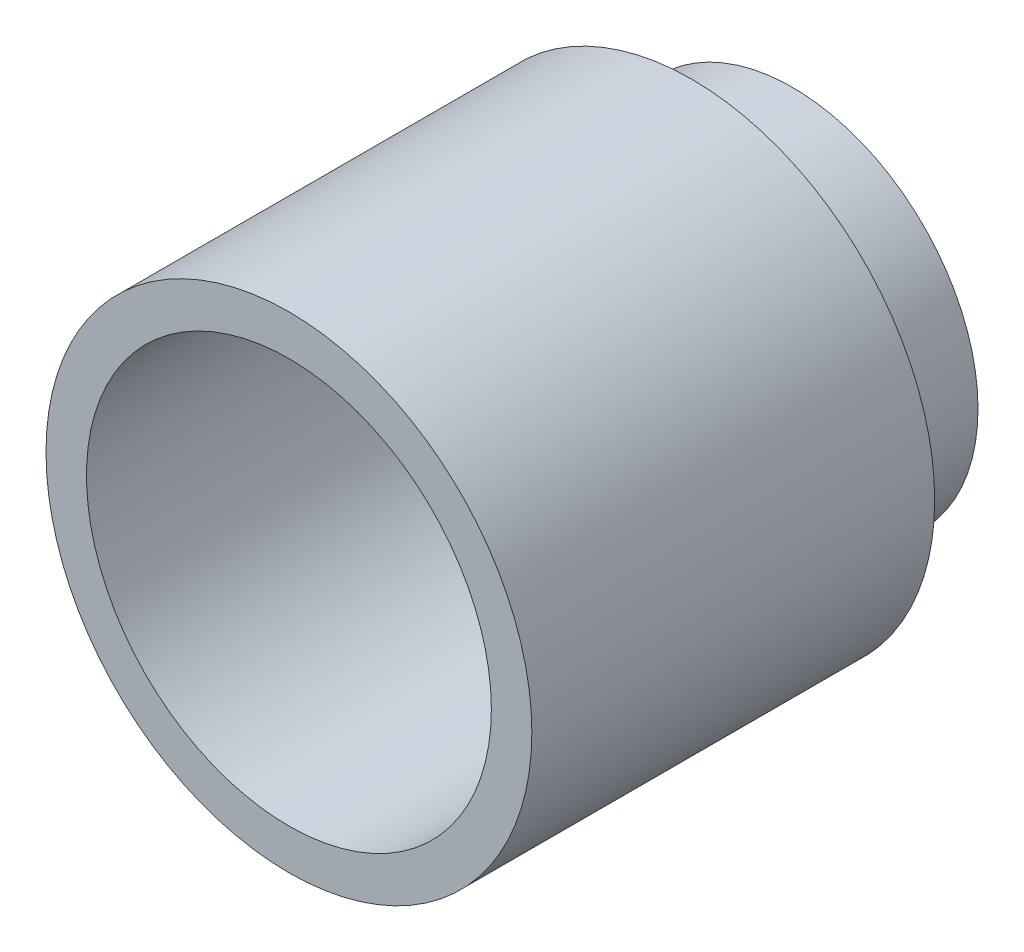
ISO-10303-21;
HEADER;
FILE_DESCRIPTION(('STEP AP214'),'2;1');
FILE_NAME('part.step','',(''),(''),'','','');
FILE_SCHEMA(('AUTOMOTIVE_DESIGN { 1 0 10303 214 1 1 1 1 }'));
ENDSEC;
DATA;
#1=APPLICATION_CONTEXT('core data for automotive mechanical design processes');
#2=APPLICATION_PROTOCOL_DEFINITION('international standard','automotive_design',2000,#1);
#3=PRODUCT_CONTEXT('',#1,'mechanical');
#4=PRODUCT('Part','Part','',(#3));
#5=PRODUCT_RELATED_PRODUCT_CATEGORY('part','',(#4));
#6=PRODUCT_DEFINITION_FORMATION('','',#4);
#7=PRODUCT_DEFINITION_CONTEXT('part definition',#1,'design');
#8=PRODUCT_DEFINITION('design','',#6,#7);
#9=PRODUCT_DEFINITION_SHAPE('','',#8);
#10=(LENGTH_UNIT() NAMED_UNIT(*) SI_UNIT(.MILLI.,.METRE.));
#11=(NAMED_UNIT(*) PLANE_ANGLE_UNIT() SI_UNIT($,.RADIAN.));
#12=(NAMED_UNIT(*) SI_UNIT($,.STERADIAN.) SOLID_ANGLE_UNIT());
#13=UNCERTAINTY_MEASURE_WITH_UNIT(LENGTH_MEASURE(1.E-05),#10,'distance_accuracy_value','');
#14=(GEOMETRIC_REPRESENTATION_CONTEXT(3) GLOBAL_UNCERTAINTY_ASSIGNED_CONTEXT((#13)) GLOBAL_UNIT_ASSIGNED_CONTEXT((#10,
#11,#12)) REPRESENTATION_CONTEXT('',''));
#15=CARTESIAN_POINT('',(0.,0.,0.));
#16=DIRECTION('',(0.,0.,1.));
#17=DIRECTION('',(1.,0.,0.));
#18=AXIS2_PLACEMENT_3D('',#15,#16,#17);
#19=CARTESIAN_POINT('',(0.,0.,20.));
#20=DIRECTION('',(0.,0.,-1.));
#21=DIRECTION('',(-1.,0.,0.));
#22=AXIS2_PLACEMENT_3D('',#19,#20,#21);
#23=CYLINDRICAL_SURFACE('',#22,18.42);
#24=CARTESIAN_POINT('',(0.,0.,0.));
#25=DIRECTION('',(0.,0.,1.));
#26=DIRECTION('',(1.,0.,0.));
#27=AXIS2_PLACEMENT_3D('',#24,#25,#26);
#28=CIRCLE('',#27,18.42);
#29=CARTESIAN_POINT('',(18.42,0.,0.));
#30=VERTEX_POINT('',#29);
#31=EDGE_CURVE('E51',#30,#30,#28,.T.);
#32=ORIENTED_EDGE('',*,*,#31,.T.);
#33=EDGE_LOOP('',(#32));
#34=FACE_BOUND('',#33,.T.);
#35=CARTESIAN_POINT('',(0.,0.,10.));
#36=DIRECTION('',(0.,0.,1.));
#37=DIRECTION('',(1.,0.,0.));
#38=AXIS2_PLACEMENT_3D('',#35,#36,#37);
#39=CIRCLE('',#38,18.42);
#40=CARTESIAN_POINT('',(18.42,0.,10.));
#41=VERTEX_POINT('',#40);
#42=EDGE_CURVE('E11',#41,#41,#39,.T.);
#43=ORIENTED_EDGE('',*,*,#42,.F.);
#44=EDGE_LOOP('',(#43));
#45=FACE_BOUND('',#44,.T.);
#46=ADVANCED_FACE('F44',(#34,#45),#23,.T.);
#47=CARTESIAN_POINT('',(0.,0.,20.));
#48=DIRECTION('',(0.,0.,1.));
#49=DIRECTION('',(1.,0.,0.));
#50=AXIS2_PLACEMENT_3D('',#47,#48,#49);
#51=PLANE('',#50);
#52=CARTESIAN_POINT('',(0.,0.,20.));
#53=DIRECTION('',(0.,0.,1.));
#54=DIRECTION('',(1.,0.,0.));
#55=AXIS2_PLACEMENT_3D('',#52,#53,#54);
#56=CIRCLE('',#55,15.35);
#57=CARTESIAN_POINT('',(15.35,0.,20.));
#58=VERTEX_POINT('',#57);
#59=EDGE_CURVE('E56',#58,#58,#56,.T.);
#60=ORIENTED_EDGE('',*,*,#59,.F.);
#61=EDGE_LOOP('',(#60));
#62=FACE_BOUND('',#61,.T.);
#63=CARTESIAN_POINT('',(0.,0.,20.));
#64=DIRECTION('',(0.,0.,1.));
#65=DIRECTION('',(1.,0.,0.));
#66=AXIS2_PLACEMENT_3D('',#63,#64,#65);
#67=CIRCLE('',#66,20.1);
#68=CARTESIAN_POINT('',(20.1,0.,20.));
#69=VERTEX_POINT('',#68);
#70=EDGE_CURVE('E66',#69,#69,#67,.F.);
#71=ORIENTED_EDGE('',*,*,#70,.F.);
#72=EDGE_LOOP('',(#71));
#73=FACE_BOUND('',#72,.T.);
#74=ADVANCED_FACE('F102',(#62,#73),#51,.T.);
#75=CARTESIAN_POINT('',(0.,0.,0.));
#76=DIRECTION('',(0.,0.,1.));
#77=DIRECTION('',(1.,0.,0.));
#78=AXIS2_PLACEMENT_3D('',#75,#76,#77);
#79=PLANE('',#78);
#80=ORIENTED_EDGE('',*,*,#31,.F.);
#81=EDGE_LOOP('',(#80));
#82=FACE_BOUND('',#81,.T.);
#83=CARTESIAN_POINT('',(0.,0.,0.));
#84=DIRECTION('',(0.,0.,1.));
#85=DIRECTION('',(1.,0.,0.));
#86=AXIS2_PLACEMENT_3D('',#83,#84,#85);
#87=CIRCLE('',#86,15.35);
#88=CARTESIAN_POINT('',(15.35,0.,0.));
#89=VERTEX_POINT('',#88);
#90=EDGE_CURVE('E61',#89,#89,#87,.T.);
#91=ORIENTED_EDGE('',*,*,#90,.T.);
#92=EDGE_LOOP('',(#91));
#93=FACE_BOUND('',#92,.T.);
#94=ADVANCED_FACE('F106',(#82,#93),#79,.F.);
#95=CARTESIAN_POINT('',(0.,0.,20.));
#96=DIRECTION('',(0.,0.,-1.));
#97=DIRECTION('',(-1.,0.,0.));
#98=AXIS2_PLACEMENT_3D('',#95,#96,#97);
#99=CYLINDRICAL_SURFACE('',#98,15.35);
#100=ORIENTED_EDGE('',*,*,#59,.T.);
#101=EDGE_LOOP('',(#100));
#102=FACE_BOUND('',#101,.T.);
#103=ORIENTED_EDGE('',*,*,#90,.F.);
#104=EDGE_LOOP('',(#103));
#105=FACE_BOUND('',#104,.T.);
#106=ADVANCED_FACE('F98',(#102,#105),#99,.F.);
#107=CARTESIAN_POINT('',(0.,0.,10.));
#108=DIRECTION('',(0.,0.,1.));
#109=DIRECTION('',(1.,0.,0.));
#110=AXIS2_PLACEMENT_3D('',#107,#108,#109);
#111=PLANE('',#110);
#112=ORIENTED_EDGE('',*,*,#42,.T.);
#113=EDGE_LOOP('',(#112));
#114=FACE_BOUND('',#113,.T.);
#115=CARTESIAN_POINT('',(0.,0.,10.));
#116=DIRECTION('',(0.,0.,1.));
#117=DIRECTION('',(1.,0.,0.));
#118=AXIS2_PLACEMENT_3D('',#115,#116,#117);
#119=CIRCLE('',#118,24.12);
#120=CARTESIAN_POINT('',(24.12,0.,10.));
#121=VERTEX_POINT('',#120);
#122=EDGE_CURVE('E72',#121,#121,#119,.T.);
#123=ORIENTED_EDGE('',*,*,#122,.F.);
#124=EDGE_LOOP('',(#123));
#125=FACE_BOUND('',#124,.T.);
#126=ADVANCED_FACE('F89',(#114,#125),#111,.F.);
#127=CARTESIAN_POINT('',(0.,0.,50.));
#128=DIRECTION('',(0.,0.,1.));
#129=DIRECTION('',(1.,0.,0.));
#130=AXIS2_PLACEMENT_3D('',#127,#128,#129);
#131=PLANE('',#130);
#132=CARTESIAN_POINT('',(0.,0.,50.));
#133=DIRECTION('',(0.,0.,1.));
#134=DIRECTION('',(1.,0.,0.));
#135=AXIS2_PLACEMENT_3D('',#132,#133,#134);
#136=CIRCLE('',#135,24.12);
#137=CARTESIAN_POINT('',(24.12,0.,50.));
#138=VERTEX_POINT('',#137);
#139=EDGE_CURVE('E71',#138,#138,#136,.T.);
#140=ORIENTED_EDGE('',*,*,#139,.T.);
#141=EDGE_LOOP('',(#140));
#142=FACE_BOUND('',#141,.T.);
#143=CARTESIAN_POINT('',(0.,0.,50.));
#144=DIRECTION('',(0.,0.,1.));
#145=DIRECTION('',(1.,0.,0.));
#146=AXIS2_PLACEMENT_3D('',#143,#144,#145);
#147=CIRCLE('',#146,20.1);
#148=CARTESIAN_POINT('',(20.1,0.,50.));
#149=VERTEX_POINT('',#148);
#150=EDGE_CURVE('E76',#149,#149,#147,.T.);
#151=ORIENTED_EDGE('',*,*,#150,.F.);
#152=EDGE_LOOP('',(#151));
#153=FACE_BOUND('',#152,.T.);
#154=ADVANCED_FACE('F86',(#142,#153),#131,.T.);
#155=CARTESIAN_POINT('',(0.,0.,50.));
#156=DIRECTION('',(0.,0.,-1.));
#157=DIRECTION('',(-1.,0.,0.));
#158=AXIS2_PLACEMENT_3D('',#155,#156,#157);
#159=CYLINDRICAL_SURFACE('',#158,24.12);
#160=ORIENTED_EDGE('',*,*,#139,.F.);
#161=EDGE_LOOP('',(#160));
#162=FACE_BOUND('',#161,.T.);
#163=ORIENTED_EDGE('',*,*,#122,.T.);
#164=EDGE_LOOP('',(#163));
#165=FACE_BOUND('',#164,.T.);
#166=ADVANCED_FACE('F88',(#162,#165),#159,.T.);
#167=CARTESIAN_POINT('',(0.,0.,50.));
#168=DIRECTION('',(0.,0.,-1.));
#169=DIRECTION('',(-1.,0.,0.));
#170=AXIS2_PLACEMENT_3D('',#167,#168,#169);
#171=CYLINDRICAL_SURFACE('',#170,20.1);
#172=ORIENTED_EDGE('',*,*,#70,.T.);
#173=EDGE_LOOP('',(#172));
#174=FACE_BOUND('',#173,.T.);
#175=ORIENTED_EDGE('',*,*,#150,.T.);
#176=EDGE_LOOP('',(#175));
#177=FACE_BOUND('',#176,.T.);
#178=ADVANCED_FACE('F84',(#174,#177),#171,.F.);
#179=CLOSED_SHELL('',(#46,#74,#94,#106,#126,#154,#166,#178));
#180=MANIFOLD_SOLID_BREP('B2',#179);
#181=ADVANCED_BREP_SHAPE_REPRESENTATION('',(#18,#180),#14);
#182=SHAPE_DEFINITION_REPRESENTATION(#9,#181);
ENDSEC;
END-ISO-10303-21;
